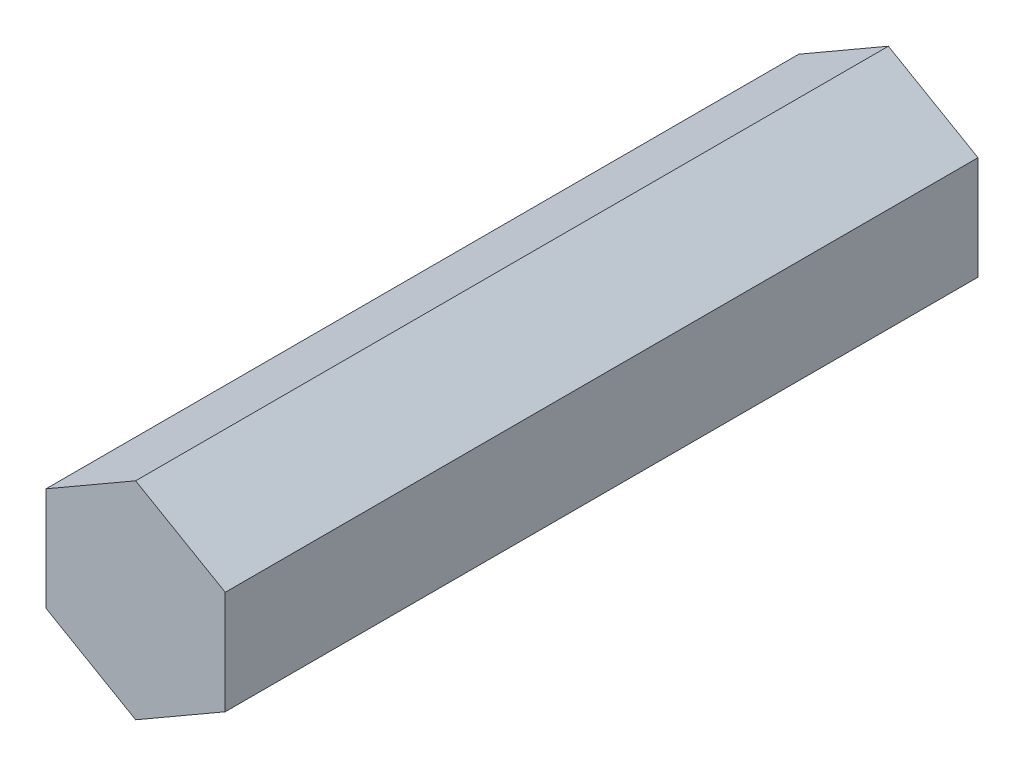
ISO-10303-21;
HEADER;
FILE_DESCRIPTION(('STEP AP214'),'2;1');
FILE_NAME('part.step','',(''),(''),'','','');
FILE_SCHEMA(('AUTOMOTIVE_DESIGN { 1 0 10303 214 1 1 1 1 }'));
ENDSEC;
DATA;
#1=APPLICATION_CONTEXT('core data for automotive mechanical design processes');
#2=APPLICATION_PROTOCOL_DEFINITION('international standard','automotive_design',2000,#1);
#3=PRODUCT_CONTEXT('',#1,'mechanical');
#4=PRODUCT('Part','Part','',(#3));
#5=PRODUCT_RELATED_PRODUCT_CATEGORY('part','',(#4));
#6=PRODUCT_DEFINITION_FORMATION('','',#4);
#7=PRODUCT_DEFINITION_CONTEXT('part definition',#1,'design');
#8=PRODUCT_DEFINITION('design','',#6,#7);
#9=PRODUCT_DEFINITION_SHAPE('','',#8);
#10=(LENGTH_UNIT() NAMED_UNIT(*) SI_UNIT(.MILLI.,.METRE.));
#11=(NAMED_UNIT(*) PLANE_ANGLE_UNIT() SI_UNIT($,.RADIAN.));
#12=(NAMED_UNIT(*) SI_UNIT($,.STERADIAN.) SOLID_ANGLE_UNIT());
#13=UNCERTAINTY_MEASURE_WITH_UNIT(LENGTH_MEASURE(1.E-05),#10,'distance_accuracy_value','');
#14=(GEOMETRIC_REPRESENTATION_CONTEXT(3) GLOBAL_UNCERTAINTY_ASSIGNED_CONTEXT((#13)) GLOBAL_UNIT_ASSIGNED_CONTEXT((#10,
#11,#12)) REPRESENTATION_CONTEXT('',''));
#15=CARTESIAN_POINT('',(0.,0.,0.));
#16=DIRECTION('',(0.,0.,1.));
#17=DIRECTION('',(1.,0.,0.));
#18=AXIS2_PLACEMENT_3D('',#15,#16,#17);
#19=CARTESIAN_POINT('',(4.7625,-2.7496306570156,20.));
#20=DIRECTION('',(-1.,0.,0.));
#21=DIRECTION('',(0.,-1.,0.));
#22=AXIS2_PLACEMENT_3D('',#19,#20,#21);
#23=PLANE('',#22);
#24=DIRECTION('',(0.,1.,0.));
#25=VECTOR('',#24,1.);
#26=CARTESIAN_POINT('',(4.7625,-2.7496306570156,-20.));
#27=LINE('',#26,#25);
#28=CARTESIAN_POINT('',(4.7625,-2.7496306570156,-20.));
#29=VERTEX_POINT('',#28);
#30=CARTESIAN_POINT('',(4.7625,2.7496306570156,-20.));
#31=VERTEX_POINT('',#30);
#32=EDGE_CURVE('E128',#29,#31,#27,.T.);
#33=ORIENTED_EDGE('',*,*,#32,.T.);
#34=DIRECTION('',(0.,0.,-1.));
#35=VECTOR('',#34,1.);
#36=CARTESIAN_POINT('',(4.7625,2.7496306570156,20.));
#37=LINE('',#36,#35);
#38=CARTESIAN_POINT('',(4.7625,2.7496306570156,20.));
#39=VERTEX_POINT('',#38);
#40=EDGE_CURVE('E11',#39,#31,#37,.T.);
#41=ORIENTED_EDGE('',*,*,#40,.F.);
#42=DIRECTION('',(0.,1.,0.));
#43=VECTOR('',#42,1.);
#44=CARTESIAN_POINT('',(4.7625,-2.7496306570156,20.));
#45=LINE('',#44,#43);
#46=CARTESIAN_POINT('',(4.7625,-2.7496306570156,20.));
#47=VERTEX_POINT('',#46);
#48=EDGE_CURVE('E144',#47,#39,#45,.T.);
#49=ORIENTED_EDGE('',*,*,#48,.F.);
#50=DIRECTION('',(0.,0.,-1.));
#51=VECTOR('',#50,1.);
#52=CARTESIAN_POINT('',(4.7625,-2.7496306570156,20.));
#53=LINE('',#52,#51);
#54=EDGE_CURVE('E124',#47,#29,#53,.T.);
#55=ORIENTED_EDGE('',*,*,#54,.T.);
#56=EDGE_LOOP('',(#33,#41,#49,#55));
#57=FACE_BOUND('',#56,.T.);
#58=ADVANCED_FACE('F39',(#57),#23,.F.);
#59=CARTESIAN_POINT('',(4.7625,2.7496306570156,20.));
#60=DIRECTION('',(-0.5,-0.866025403784439,0.));
#61=DIRECTION('',(0.866025403784439,-0.5,0.));
#62=AXIS2_PLACEMENT_3D('',#59,#60,#61);
#63=PLANE('',#62);
#64=DIRECTION('',(-0.866025403784439,0.5,0.));
#65=VECTOR('',#64,1.);
#66=CARTESIAN_POINT('',(4.7625,2.7496306570156,-20.));
#67=LINE('',#66,#65);
#68=CARTESIAN_POINT('',(0.,5.49926131403118,-20.));
#69=VERTEX_POINT('',#68);
#70=EDGE_CURVE('E132',#31,#69,#67,.T.);
#71=ORIENTED_EDGE('',*,*,#70,.T.);
#72=DIRECTION('',(0.,0.,-1.));
#73=VECTOR('',#72,1.);
#74=CARTESIAN_POINT('',(0.,5.49926131403118,20.));
#75=LINE('',#74,#73);
#76=CARTESIAN_POINT('',(0.,5.49926131403118,20.));
#77=VERTEX_POINT('',#76);
#78=EDGE_CURVE('E48',#77,#69,#75,.T.);
#79=ORIENTED_EDGE('',*,*,#78,.F.);
#80=DIRECTION('',(-0.866025403784439,0.5,0.));
#81=VECTOR('',#80,1.);
#82=CARTESIAN_POINT('',(4.7625,2.7496306570156,20.));
#83=LINE('',#82,#81);
#84=EDGE_CURVE('E93',#39,#77,#83,.T.);
#85=ORIENTED_EDGE('',*,*,#84,.F.);
#86=ORIENTED_EDGE('',*,*,#40,.T.);
#87=EDGE_LOOP('',(#71,#79,#85,#86));
#88=FACE_BOUND('',#87,.T.);
#89=ADVANCED_FACE('F172',(#88),#63,.F.);
#90=CARTESIAN_POINT('',(0.,5.49926131403118,20.));
#91=DIRECTION('',(0.5,-0.866025403784439,0.));
#92=DIRECTION('',(0.866025403784439,0.5,0.));
#93=AXIS2_PLACEMENT_3D('',#90,#91,#92);
#94=PLANE('',#93);
#95=DIRECTION('',(-0.866025403784439,-0.5,0.));
#96=VECTOR('',#95,1.);
#97=CARTESIAN_POINT('',(0.,5.49926131403118,-20.));
#98=LINE('',#97,#96);
#99=CARTESIAN_POINT('',(-4.7625,2.74963065701559,-20.));
#100=VERTEX_POINT('',#99);
#101=EDGE_CURVE('E135',#69,#100,#98,.T.);
#102=ORIENTED_EDGE('',*,*,#101,.T.);
#103=DIRECTION('',(0.,0.,-1.));
#104=VECTOR('',#103,1.);
#105=CARTESIAN_POINT('',(-4.7625,2.74963065701559,20.));
#106=LINE('',#105,#104);
#107=CARTESIAN_POINT('',(-4.7625,2.74963065701559,20.));
#108=VERTEX_POINT('',#107);
#109=EDGE_CURVE('E117',#108,#100,#106,.T.);
#110=ORIENTED_EDGE('',*,*,#109,.F.);
#111=DIRECTION('',(-0.866025403784439,-0.5,0.));
#112=VECTOR('',#111,1.);
#113=CARTESIAN_POINT('',(0.,5.49926131403118,20.));
#114=LINE('',#113,#112);
#115=EDGE_CURVE('E106',#77,#108,#114,.T.);
#116=ORIENTED_EDGE('',*,*,#115,.F.);
#117=ORIENTED_EDGE('',*,*,#78,.T.);
#118=EDGE_LOOP('',(#102,#110,#116,#117));
#119=FACE_BOUND('',#118,.T.);
#120=ADVANCED_FACE('F154',(#119),#94,.F.);
#121=CARTESIAN_POINT('',(-4.7625,2.74963065701559,20.));
#122=DIRECTION('',(1.,0.,0.));
#123=DIRECTION('',(0.,1.,0.));
#124=AXIS2_PLACEMENT_3D('',#121,#122,#123);
#125=PLANE('',#124);
#126=DIRECTION('',(0.,-1.,0.));
#127=VECTOR('',#126,1.);
#128=CARTESIAN_POINT('',(-4.7625,2.74963065701559,-20.));
#129=LINE('',#128,#127);
#130=CARTESIAN_POINT('',(-4.7625,-2.74963065701559,-20.));
#131=VERTEX_POINT('',#130);
#132=EDGE_CURVE('E115',#100,#131,#129,.T.);
#133=ORIENTED_EDGE('',*,*,#132,.T.);
#134=DIRECTION('',(0.,0.,-1.));
#135=VECTOR('',#134,1.);
#136=CARTESIAN_POINT('',(-4.7625,-2.74963065701559,20.));
#137=LINE('',#136,#135);
#138=CARTESIAN_POINT('',(-4.7625,-2.74963065701559,20.));
#139=VERTEX_POINT('',#138);
#140=EDGE_CURVE('E112',#139,#131,#137,.T.);
#141=ORIENTED_EDGE('',*,*,#140,.F.);
#142=DIRECTION('',(0.,-1.,0.));
#143=VECTOR('',#142,1.);
#144=CARTESIAN_POINT('',(-4.7625,2.74963065701559,20.));
#145=LINE('',#144,#143);
#146=EDGE_CURVE('E100',#108,#139,#145,.T.);
#147=ORIENTED_EDGE('',*,*,#146,.F.);
#148=ORIENTED_EDGE('',*,*,#109,.T.);
#149=EDGE_LOOP('',(#133,#141,#147,#148));
#150=FACE_BOUND('',#149,.T.);
#151=ADVANCED_FACE('F113',(#150),#125,.F.);
#152=CARTESIAN_POINT('',(-4.7625,-2.74963065701559,20.));
#153=DIRECTION('',(0.5,0.866025403784439,0.));
#154=DIRECTION('',(-0.866025403784439,0.5,0.));
#155=AXIS2_PLACEMENT_3D('',#152,#153,#154);
#156=PLANE('',#155);
#157=DIRECTION('',(0.866025403784439,-0.5,0.));
#158=VECTOR('',#157,1.);
#159=CARTESIAN_POINT('',(-4.7625,-2.74963065701559,-20.));
#160=LINE('',#159,#158);
#161=CARTESIAN_POINT('',(0.,-5.49926131403119,-20.));
#162=VERTEX_POINT('',#161);
#163=EDGE_CURVE('E79',#131,#162,#160,.T.);
#164=ORIENTED_EDGE('',*,*,#163,.T.);
#165=DIRECTION('',(0.,0.,-1.));
#166=VECTOR('',#165,1.);
#167=CARTESIAN_POINT('',(0.,-5.49926131403119,20.));
#168=LINE('',#167,#166);
#169=CARTESIAN_POINT('',(0.,-5.49926131403119,20.));
#170=VERTEX_POINT('',#169);
#171=EDGE_CURVE('E118',#170,#162,#168,.T.);
#172=ORIENTED_EDGE('',*,*,#171,.F.);
#173=DIRECTION('',(0.866025403784439,-0.5,0.));
#174=VECTOR('',#173,1.);
#175=CARTESIAN_POINT('',(-4.7625,-2.74963065701559,20.));
#176=LINE('',#175,#174);
#177=EDGE_CURVE('E104',#139,#170,#176,.T.);
#178=ORIENTED_EDGE('',*,*,#177,.F.);
#179=ORIENTED_EDGE('',*,*,#140,.T.);
#180=EDGE_LOOP('',(#164,#172,#178,#179));
#181=FACE_BOUND('',#180,.T.);
#182=ADVANCED_FACE('F120',(#181),#156,.F.);
#183=CARTESIAN_POINT('',(0.,-5.49926131403119,20.));
#184=DIRECTION('',(-0.5,0.866025403784438,0.));
#185=DIRECTION('',(-0.866025403784439,-0.5,0.));
#186=AXIS2_PLACEMENT_3D('',#183,#184,#185);
#187=PLANE('',#186);
#188=DIRECTION('',(0.866025403784439,0.5,0.));
#189=VECTOR('',#188,1.);
#190=CARTESIAN_POINT('',(0.,-5.49926131403119,-20.));
#191=LINE('',#190,#189);
#192=EDGE_CURVE('E85',#162,#29,#191,.T.);
#193=ORIENTED_EDGE('',*,*,#192,.T.);
#194=ORIENTED_EDGE('',*,*,#54,.F.);
#195=DIRECTION('',(0.866025403784439,0.5,0.));
#196=VECTOR('',#195,1.);
#197=CARTESIAN_POINT('',(0.,-5.49926131403119,20.));
#198=LINE('',#197,#196);
#199=EDGE_CURVE('E56',#170,#47,#198,.T.);
#200=ORIENTED_EDGE('',*,*,#199,.F.);
#201=ORIENTED_EDGE('',*,*,#171,.T.);
#202=EDGE_LOOP('',(#193,#194,#200,#201));
#203=FACE_BOUND('',#202,.T.);
#204=ADVANCED_FACE('F161',(#203),#187,.F.);
#205=CARTESIAN_POINT('',(0.,0.,20.));
#206=DIRECTION('',(0.,0.,1.));
#207=DIRECTION('',(1.,0.,0.));
#208=AXIS2_PLACEMENT_3D('',#205,#206,#207);
#209=PLANE('',#208);
#210=ORIENTED_EDGE('',*,*,#48,.T.);
#211=ORIENTED_EDGE('',*,*,#84,.T.);
#212=ORIENTED_EDGE('',*,*,#115,.T.);
#213=ORIENTED_EDGE('',*,*,#146,.T.);
#214=ORIENTED_EDGE('',*,*,#177,.T.);
#215=ORIENTED_EDGE('',*,*,#199,.T.);
#216=EDGE_LOOP('',(#210,#211,#212,#213,#214,#215));
#217=FACE_BOUND('',#216,.T.);
#218=ADVANCED_FACE('F102',(#217),#209,.T.);
#219=CARTESIAN_POINT('',(0.,0.,-20.));
#220=DIRECTION('',(0.,0.,1.));
#221=DIRECTION('',(1.,0.,0.));
#222=AXIS2_PLACEMENT_3D('',#219,#220,#221);
#223=PLANE('',#222);
#224=ORIENTED_EDGE('',*,*,#32,.F.);
#225=ORIENTED_EDGE('',*,*,#192,.F.);
#226=ORIENTED_EDGE('',*,*,#163,.F.);
#227=ORIENTED_EDGE('',*,*,#132,.F.);
#228=ORIENTED_EDGE('',*,*,#101,.F.);
#229=ORIENTED_EDGE('',*,*,#70,.F.);
#230=EDGE_LOOP('',(#224,#225,#226,#227,#228,#229));
#231=FACE_BOUND('',#230,.T.);
#232=ADVANCED_FACE('F157',(#231),#223,.F.);
#233=CLOSED_SHELL('',(#58,#89,#120,#151,#182,#204,#218,#232));
#234=MANIFOLD_SOLID_BREP('B2',#233);
#235=ADVANCED_BREP_SHAPE_REPRESENTATION('',(#18,#234),#14);
#236=SHAPE_DEFINITION_REPRESENTATION(#9,#235);
ENDSEC;
END-ISO-10303-21;
